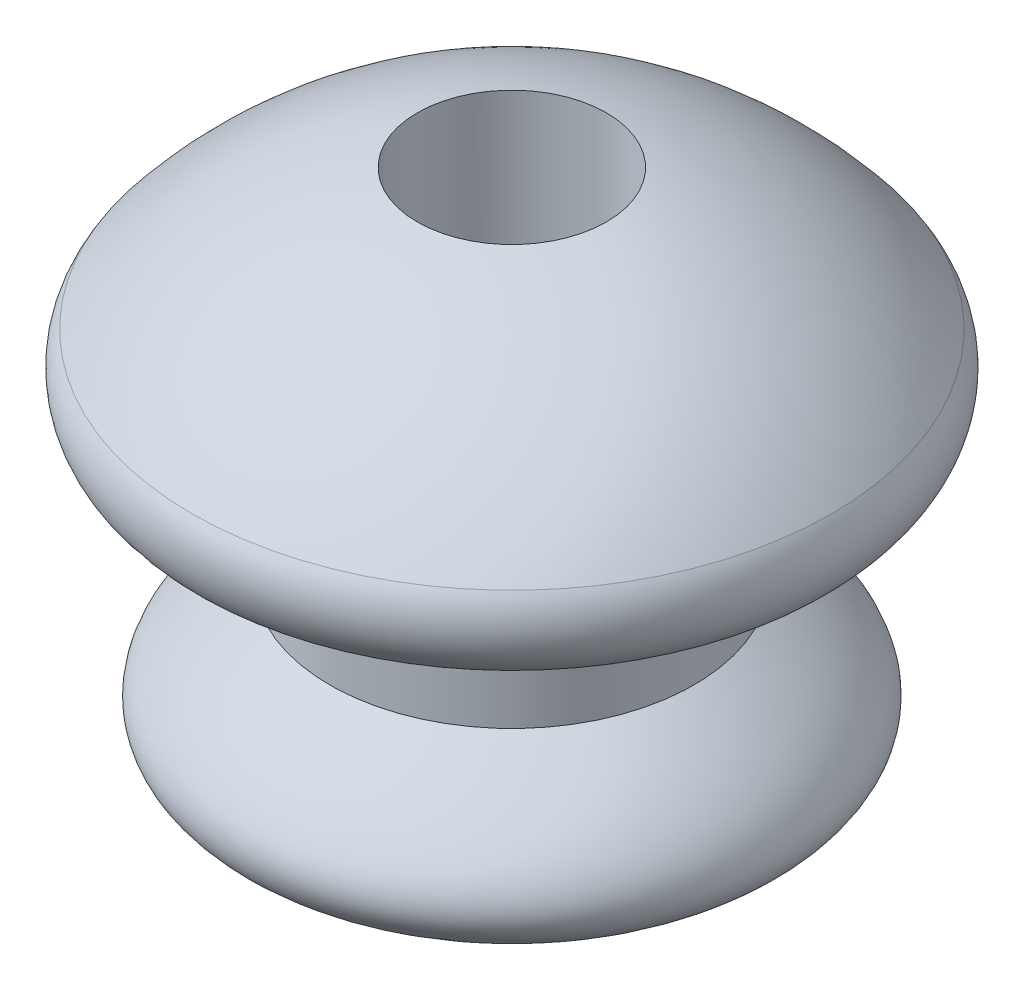
ISO-10303-21;
HEADER;
FILE_DESCRIPTION(('STEP AP214'),'2;1');
FILE_NAME('part.step','',(''),(''),'','','');
FILE_SCHEMA(('AUTOMOTIVE_DESIGN { 1 0 10303 214 1 1 1 1 }'));
ENDSEC;
DATA;
#1=APPLICATION_CONTEXT('core data for automotive mechanical design processes');
#2=APPLICATION_PROTOCOL_DEFINITION('international standard','automotive_design',2000,#1);
#3=PRODUCT_CONTEXT('',#1,'mechanical');
#4=PRODUCT('Part','Part','',(#3));
#5=PRODUCT_RELATED_PRODUCT_CATEGORY('part','',(#4));
#6=PRODUCT_DEFINITION_FORMATION('','',#4);
#7=PRODUCT_DEFINITION_CONTEXT('part definition',#1,'design');
#8=PRODUCT_DEFINITION('design','',#6,#7);
#9=PRODUCT_DEFINITION_SHAPE('','',#8);
#10=(LENGTH_UNIT() NAMED_UNIT(*) SI_UNIT(.MILLI.,.METRE.));
#11=(NAMED_UNIT(*) PLANE_ANGLE_UNIT() SI_UNIT($,.RADIAN.));
#12=(NAMED_UNIT(*) SI_UNIT($,.STERADIAN.) SOLID_ANGLE_UNIT());
#13=UNCERTAINTY_MEASURE_WITH_UNIT(LENGTH_MEASURE(1.E-05),#10,'distance_accuracy_value','');
#14=(GEOMETRIC_REPRESENTATION_CONTEXT(3) GLOBAL_UNCERTAINTY_ASSIGNED_CONTEXT((#13)) GLOBAL_UNIT_ASSIGNED_CONTEXT((#10,
#11,#12)) REPRESENTATION_CONTEXT('',''));
#15=CARTESIAN_POINT('',(0.,0.,0.));
#16=DIRECTION('',(0.,0.,1.));
#17=DIRECTION('',(1.,0.,0.));
#18=AXIS2_PLACEMENT_3D('',#15,#16,#17);
#19=CARTESIAN_POINT('',(-0.0246690593247684,-4.55193907927887,0.));
#20=DIRECTION('',(0.,1.,0.));
#21=DIRECTION('',(-1.,0.,0.));
#22=AXIS2_PLACEMENT_3D('',#19,#20,#21);
#23=DEGENERATE_TOROIDAL_SURFACE('',#22,0.0750108123259097,4.24243475324604,.T.);
#24=CARTESIAN_POINT('',(-0.0246690593247689,-0.41157102338869,0.));
#25=DIRECTION('',(0.,-1.,0.));
#26=DIRECTION('',(1.,0.,0.));
#27=AXIS2_PLACEMENT_3D('',#24,#25,#26);
#28=CIRCLE('',#27,1.);
#29=CARTESIAN_POINT('',(0.975330940675231,-0.41157102338869,0.));
#30=VERTEX_POINT('',#29);
#31=EDGE_CURVE('E38',#30,#30,#28,.F.);
#32=ORIENTED_EDGE('',*,*,#31,.F.);
#33=EDGE_LOOP('',(#32));
#34=FACE_BOUND('',#33,.T.);
#35=CARTESIAN_POINT('',(-0.0246690593247687,-1.89326724337437,0.));
#36=DIRECTION('',(0.,1.,0.));
#37=DIRECTION('',(-1.,0.,0.));
#38=AXIS2_PLACEMENT_3D('',#35,#36,#37);
#39=CIRCLE('',#38,3.38102301806835);
#40=CARTESIAN_POINT('',(-3.40569207739312,-1.89326724337437,0.));
#41=VERTEX_POINT('',#40);
#42=EDGE_CURVE('E51',#41,#41,#39,.T.);
#43=ORIENTED_EDGE('',*,*,#42,.T.);
#44=EDGE_LOOP('',(#43));
#45=FACE_BOUND('',#44,.T.);
#46=ADVANCED_FACE('F33',(#34,#45),#23,.T.);
#47=CARTESIAN_POINT('',(1.90146974711775,-4.18789083274121,0.));
#48=CARTESIAN_POINT('',(3.99780339277794,-5.50535285109693,0.));
#49=CARTESIAN_POINT('',(2.40138714966272,-6.00367518527237,0.));
#50=CARTESIAN_POINT('',(0.316595481163095,-6.15804567850246,0.));
#51=B_SPLINE_CURVE_WITH_KNOTS('',3,(#47,#48,#49,#50),.UNSPECIFIED.,.F.,.F.,(4,4),(0.,1.),.UNSPECIFIED.);
#52=CARTESIAN_POINT('',(-0.0246690593247689,-4.14544838699157E-05,0.));
#53=DIRECTION('',(0.,1.,0.));
#54=AXIS1_PLACEMENT('',#52,#53);
#55=SURFACE_OF_REVOLUTION('',#51,#54);
#56=CARTESIAN_POINT('',(-0.0246690593247683,-6.09486532054408,0.));
#57=DIRECTION('',(0.,1.,0.));
#58=DIRECTION('',(-1.,0.,0.));
#59=AXIS2_PLACEMENT_3D('',#56,#57,#58);
#60=CIRCLE('',#59,1.);
#61=CARTESIAN_POINT('',(-1.02466905932477,-6.09486532054408,0.));
#62=VERTEX_POINT('',#61);
#63=EDGE_CURVE('E53',#62,#62,#60,.F.);
#64=ORIENTED_EDGE('',*,*,#63,.F.);
#65=EDGE_LOOP('',(#64));
#66=FACE_BOUND('',#65,.T.);
#67=CARTESIAN_POINT('',(-0.0246690593247685,-4.18789083274121,0.));
#68=DIRECTION('',(0.,1.,0.));
#69=DIRECTION('',(-1.,0.,0.));
#70=AXIS2_PLACEMENT_3D('',#67,#68,#69);
#71=CIRCLE('',#70,1.92613880644252);
#72=CARTESIAN_POINT('',(-1.95080786576729,-4.18789083274121,0.));
#73=VERTEX_POINT('',#72);
#74=EDGE_CURVE('E10',#73,#73,#71,.T.);
#75=ORIENTED_EDGE('',*,*,#74,.F.);
#76=EDGE_LOOP('',(#75));
#77=FACE_BOUND('',#76,.T.);
#78=ADVANCED_FACE('F35',(#66,#77),#55,.F.);
#79=CARTESIAN_POINT('',(-0.0246690593247689,-4.14544838699157E-05,0.));
#80=DIRECTION('',(0.,1.,0.));
#81=DIRECTION('',(-1.,0.,0.));
#82=AXIS2_PLACEMENT_3D('',#79,#80,#81);
#83=CYLINDRICAL_SURFACE('',#82,1.92613880644252);
#84=CARTESIAN_POINT('',(-0.0246690593247686,-2.68789083274121,0.));
#85=DIRECTION('',(0.,1.,0.));
#86=DIRECTION('',(-1.,0.,0.));
#87=AXIS2_PLACEMENT_3D('',#84,#85,#86);
#88=CIRCLE('',#87,1.92613880644252);
#89=CARTESIAN_POINT('',(-1.95080786576729,-2.68789083274121,0.));
#90=VERTEX_POINT('',#89);
#91=EDGE_CURVE('E42',#90,#90,#88,.T.);
#92=ORIENTED_EDGE('',*,*,#91,.F.);
#93=EDGE_LOOP('',(#92));
#94=FACE_BOUND('',#93,.T.);
#95=ORIENTED_EDGE('',*,*,#74,.T.);
#96=EDGE_LOOP('',(#95));
#97=FACE_BOUND('',#96,.T.);
#98=ADVANCED_FACE('F84',(#94,#97),#83,.T.);
#99=CARTESIAN_POINT('',(0.,-2.68789083274121,0.));
#100=DIRECTION('',(0.,1.,0.));
#101=DIRECTION('',(-1.,0.,0.));
#102=AXIS2_PLACEMENT_3D('',#99,#100,#101);
#103=PLANE('',#102);
#104=CARTESIAN_POINT('',(-0.0246690593247686,-2.68789083274121,0.));
#105=DIRECTION('',(0.,1.,0.));
#106=DIRECTION('',(-1.,0.,0.));
#107=AXIS2_PLACEMENT_3D('',#104,#105,#106);
#108=CIRCLE('',#107,3.29550419741783);
#109=CARTESIAN_POINT('',(-3.3201732567426,-2.68789083274121,0.));
#110=VERTEX_POINT('',#109);
#111=EDGE_CURVE('E46',#110,#110,#108,.T.);
#112=ORIENTED_EDGE('',*,*,#111,.F.);
#113=EDGE_LOOP('',(#112));
#114=FACE_BOUND('',#113,.T.);
#115=ORIENTED_EDGE('',*,*,#91,.T.);
#116=EDGE_LOOP('',(#115));
#117=FACE_BOUND('',#116,.T.);
#118=ADVANCED_FACE('F76',(#114,#117),#103,.F.);
#119=CARTESIAN_POINT('',(-0.0246690593247684,-2.2390931905268,0.));
#120=DIRECTION('',(0.,1.,0.));
#121=DIRECTION('',(-1.,0.,0.));
#122=AXIS2_PLACEMENT_3D('',#119,#120,#121);
#123=TOROIDAL_SURFACE('',#122,2.8598675230513,0.625458740214205);
#124=ORIENTED_EDGE('',*,*,#111,.T.);
#125=EDGE_LOOP('',(#124));
#126=FACE_BOUND('',#125,.T.);
#127=ORIENTED_EDGE('',*,*,#42,.F.);
#128=EDGE_LOOP('',(#127));
#129=FACE_BOUND('',#128,.T.);
#130=ADVANCED_FACE('F74',(#126,#129),#123,.T.);
#131=CARTESIAN_POINT('',(-0.0246690593247689,-0.309504326032827,0.));
#132=DIRECTION('',(0.,-1.,0.));
#133=DIRECTION('',(1.,0.,0.));
#134=AXIS2_PLACEMENT_3D('',#131,#132,#133);
#135=CYLINDRICAL_SURFACE('',#134,1.);
#136=ORIENTED_EDGE('',*,*,#63,.T.);
#137=EDGE_LOOP('',(#136));
#138=FACE_BOUND('',#137,.T.);
#139=ORIENTED_EDGE('',*,*,#31,.T.);
#140=EDGE_LOOP('',(#139));
#141=FACE_BOUND('',#140,.T.);
#142=ADVANCED_FACE('F67',(#138,#141),#135,.F.);
#143=CLOSED_SHELL('',(#46,#78,#98,#118,#130,#142));
#144=MANIFOLD_SOLID_BREP('B2',#143);
#145=ADVANCED_BREP_SHAPE_REPRESENTATION('',(#18,#144),#14);
#146=SHAPE_DEFINITION_REPRESENTATION(#9,#145);
ENDSEC;
END-ISO-10303-21;
